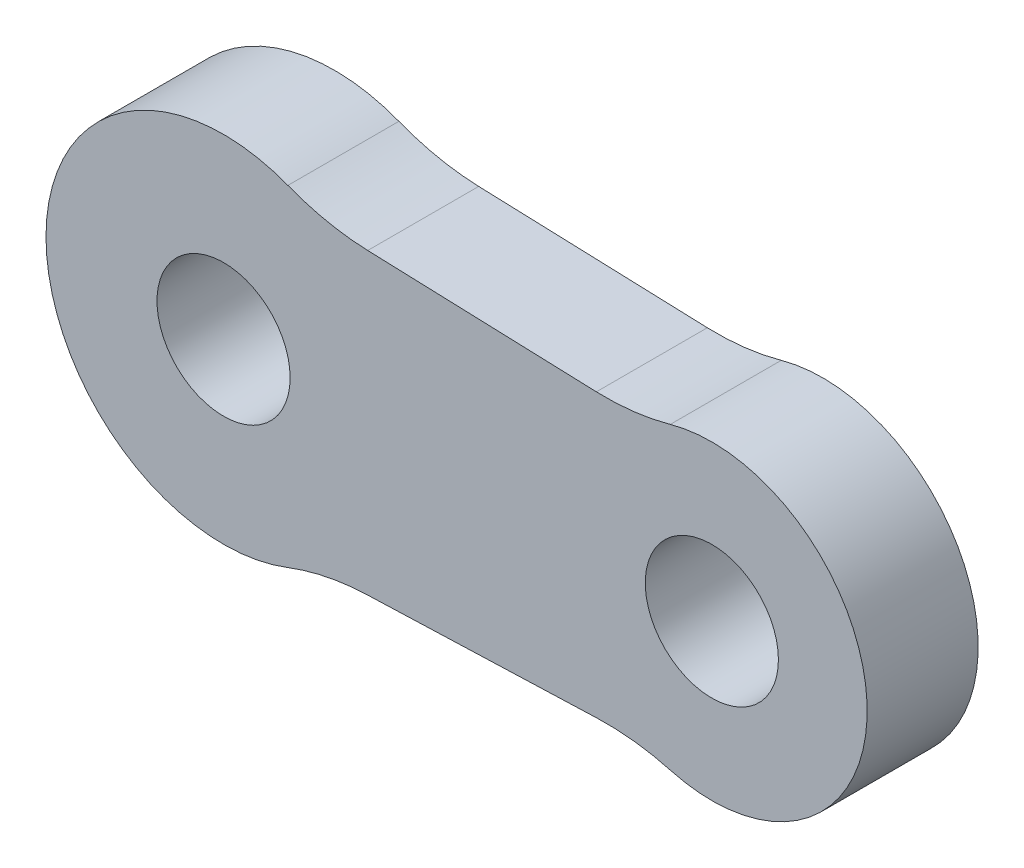
ISO-10303-21;
HEADER;
FILE_DESCRIPTION(('STEP AP214'),'2;1');
FILE_NAME('part.step','',(''),(''),'','','');
FILE_SCHEMA(('AUTOMOTIVE_DESIGN { 1 0 10303 214 1 1 1 1 }'));
ENDSEC;
DATA;
#1=APPLICATION_CONTEXT('core data for automotive mechanical design processes');
#2=APPLICATION_PROTOCOL_DEFINITION('international standard','automotive_design',2000,#1);
#3=PRODUCT_CONTEXT('',#1,'mechanical');
#4=PRODUCT('Part','Part','',(#3));
#5=PRODUCT_RELATED_PRODUCT_CATEGORY('part','',(#4));
#6=PRODUCT_DEFINITION_FORMATION('','',#4);
#7=PRODUCT_DEFINITION_CONTEXT('part definition',#1,'design');
#8=PRODUCT_DEFINITION('design','',#6,#7);
#9=PRODUCT_DEFINITION_SHAPE('','',#8);
#10=(LENGTH_UNIT() NAMED_UNIT(*) SI_UNIT(.MILLI.,.METRE.));
#11=(NAMED_UNIT(*) PLANE_ANGLE_UNIT() SI_UNIT($,.RADIAN.));
#12=(NAMED_UNIT(*) SI_UNIT($,.STERADIAN.) SOLID_ANGLE_UNIT());
#13=UNCERTAINTY_MEASURE_WITH_UNIT(LENGTH_MEASURE(1.E-05),#10,'distance_accuracy_value','');
#14=(GEOMETRIC_REPRESENTATION_CONTEXT(3) GLOBAL_UNCERTAINTY_ASSIGNED_CONTEXT((#13)) GLOBAL_UNIT_ASSIGNED_CONTEXT((#10,
#11,#12)) REPRESENTATION_CONTEXT('',''));
#15=CARTESIAN_POINT('',(0.,0.,0.));
#16=DIRECTION('',(0.,0.,1.));
#17=DIRECTION('',(1.,0.,0.));
#18=AXIS2_PLACEMENT_3D('',#15,#16,#17);
#19=CARTESIAN_POINT('',(34.4240037757681,88.5437065185658,25.));
#20=DIRECTION('',(0.,0.,-1.));
#21=DIRECTION('',(-1.,0.,0.));
#22=AXIS2_PLACEMENT_3D('',#19,#20,#21);
#23=PLANE('',#22);
#24=CARTESIAN_POINT('',(34.4240037757681,88.5437065185658,25.));
#25=DIRECTION('',(0.,0.,-1.));
#26=DIRECTION('',(-1.,0.,0.));
#27=AXIS2_PLACEMENT_3D('',#24,#25,#26);
#28=CIRCLE('',#27,55.);
#29=CARTESIAN_POINT('',(32.4799003556117,33.5780766950867,25.));
#30=VERTEX_POINT('',#29);
#31=CARTESIAN_POINT('',(14.4943173792708,37.2815606393961,25.));
#32=VERTEX_POINT('',#31);
#33=EDGE_CURVE('E229',#30,#32,#28,.T.);
#34=ORIENTED_EDGE('',*,*,#33,.T.);
#35=CARTESIAN_POINT('',(0.,0.,25.));
#36=DIRECTION('',(0.,0.,1.));
#37=DIRECTION('',(1.,0.,0.));
#38=AXIS2_PLACEMENT_3D('',#35,#36,#37);
#39=CIRCLE('',#38,40.);
#40=CARTESIAN_POINT('',(14.3913774062676,-37.3214181985408,25.));
#41=VERTEX_POINT('',#40);
#42=EDGE_CURVE('E155',#32,#41,#39,.T.);
#43=ORIENTED_EDGE('',*,*,#42,.T.);
#44=CARTESIAN_POINT('',(34.1795213398855,-88.6383682215343,25.));
#45=DIRECTION('',(0.,0.,1.));
#46=DIRECTION('',(1.,0.,0.));
#47=AXIS2_PLACEMENT_3D('',#44,#45,#46);
#48=CIRCLE('',#47,55.);
#49=CARTESIAN_POINT('',(32.2284041769591,-33.67298691824,25.));
#50=VERTEX_POINT('',#49);
#51=EDGE_CURVE('E248',#50,#41,#48,.T.);
#52=ORIENTED_EDGE('',*,*,#51,.F.);
#53=DIRECTION('',(0.999370569150805,0.0354748575077526,0.));
#54=VECTOR('',#53,1.);
#55=CARTESIAN_POINT('',(32.2284041769591,-33.67298691824,25.));
#56=LINE('',#55,#54);
#57=CARTESIAN_POINT('',(84.2350153261261,-31.8268978128289,25.));
#58=VERTEX_POINT('',#57);
#59=EDGE_CURVE('E263',#50,#58,#56,.T.);
#60=ORIENTED_EDGE('',*,*,#59,.T.);
#61=CARTESIAN_POINT('',(86.1861324890525,-86.7922791161232,25.));
#62=DIRECTION('',(0.,0.,-1.));
#63=DIRECTION('',(-1.,0.,0.));
#64=AXIS2_PLACEMENT_3D('',#61,#62,#63);
#65=CIRCLE('',#64,55.);
#66=CARTESIAN_POINT('',(100.73905152352,-33.7525529896035,25.));
#67=VERTEX_POINT('',#66);
#68=EDGE_CURVE('E178',#58,#67,#65,.T.);
#69=ORIENTED_EDGE('',*,*,#68,.T.);
#70=CARTESIAN_POINT('',(110.,0.,25.));
#71=DIRECTION('',(0.,0.,1.));
#72=DIRECTION('',(1.,0.,0.));
#73=AXIS2_PLACEMENT_3D('',#70,#71,#72);
#74=CIRCLE('',#73,35.);
#75=CARTESIAN_POINT('',(100.639908058213,33.7251935330443,25.));
#76=VERTEX_POINT('',#75);
#77=EDGE_CURVE('E171',#67,#76,#74,.T.);
#78=ORIENTED_EDGE('',*,*,#77,.T.);
#79=CARTESIAN_POINT('',(85.9311921496908,86.7219262278283,25.));
#80=DIRECTION('',(0.,0.,1.));
#81=DIRECTION('',(1.,0.,0.));
#82=AXIS2_PLACEMENT_3D('',#79,#80,#81);
#83=CIRCLE('',#82,55.);
#84=CARTESIAN_POINT('',(83.9870887295343,31.7562964043492,25.));
#85=VERTEX_POINT('',#84);
#86=EDGE_CURVE('E176',#85,#76,#83,.T.);
#87=ORIENTED_EDGE('',*,*,#86,.F.);
#88=DIRECTION('',(0.99937508769962,-0.0353473349119357,0.));
#89=VECTOR('',#88,1.);
#90=CARTESIAN_POINT('',(32.4799003556117,33.5780766950867,25.));
#91=LINE('',#90,#89);
#92=EDGE_CURVE('E196',#30,#85,#91,.T.);
#93=ORIENTED_EDGE('',*,*,#92,.F.);
#94=EDGE_LOOP('',(#34,#43,#52,#60,#69,#78,#87,#93));
#95=FACE_BOUND('',#94,.T.);
#96=CARTESIAN_POINT('',(0.,0.,25.));
#97=DIRECTION('',(0.,0.,1.));
#98=DIRECTION('',(1.,0.,0.));
#99=AXIS2_PLACEMENT_3D('',#96,#97,#98);
#100=CIRCLE('',#99,15.);
#101=CARTESIAN_POINT('',(15.,0.,25.));
#102=VERTEX_POINT('',#101);
#103=EDGE_CURVE('E206',#102,#102,#100,.T.);
#104=ORIENTED_EDGE('',*,*,#103,.F.);
#105=EDGE_LOOP('',(#104));
#106=FACE_BOUND('',#105,.T.);
#107=CARTESIAN_POINT('',(110.,0.,25.));
#108=DIRECTION('',(0.,0.,1.));
#109=DIRECTION('',(1.,0.,0.));
#110=AXIS2_PLACEMENT_3D('',#107,#108,#109);
#111=CIRCLE('',#110,15.);
#112=CARTESIAN_POINT('',(125.,0.,25.));
#113=VERTEX_POINT('',#112);
#114=EDGE_CURVE('E277',#113,#113,#111,.T.);
#115=ORIENTED_EDGE('',*,*,#114,.F.);
#116=EDGE_LOOP('',(#115));
#117=FACE_BOUND('',#116,.T.);
#118=ADVANCED_FACE('F99',(#95,#106,#117),#23,.F.);
#119=CARTESIAN_POINT('',(34.4240037757681,88.5437065185658,0.));
#120=DIRECTION('',(0.,0.,-1.));
#121=DIRECTION('',(-1.,0.,0.));
#122=AXIS2_PLACEMENT_3D('',#119,#120,#121);
#123=PLANE('',#122);
#124=CARTESIAN_POINT('',(0.,0.,0.));
#125=DIRECTION('',(0.,0.,1.));
#126=DIRECTION('',(1.,0.,0.));
#127=AXIS2_PLACEMENT_3D('',#124,#125,#126);
#128=CIRCLE('',#127,15.);
#129=CARTESIAN_POINT('',(15.,0.,0.));
#130=VERTEX_POINT('',#129);
#131=EDGE_CURVE('E273',#130,#130,#128,.T.);
#132=ORIENTED_EDGE('',*,*,#131,.T.);
#133=EDGE_LOOP('',(#132));
#134=FACE_BOUND('',#133,.T.);
#135=CARTESIAN_POINT('',(34.4240037757681,88.5437065185658,0.));
#136=DIRECTION('',(0.,0.,-1.));
#137=DIRECTION('',(-1.,0.,0.));
#138=AXIS2_PLACEMENT_3D('',#135,#136,#137);
#139=CIRCLE('',#138,55.);
#140=CARTESIAN_POINT('',(32.4799003556117,33.5780766950867,0.));
#141=VERTEX_POINT('',#140);
#142=CARTESIAN_POINT('',(14.4943173792708,37.2815606393961,0.));
#143=VERTEX_POINT('',#142);
#144=EDGE_CURVE('E202',#141,#143,#139,.T.);
#145=ORIENTED_EDGE('',*,*,#144,.F.);
#146=DIRECTION('',(0.99937508769962,-0.0353473349119357,0.));
#147=VECTOR('',#146,1.);
#148=CARTESIAN_POINT('',(32.4799003556117,33.5780766950867,0.));
#149=LINE('',#148,#147);
#150=CARTESIAN_POINT('',(83.9870887295343,31.7562964043492,0.));
#151=VERTEX_POINT('',#150);
#152=EDGE_CURVE('E225',#141,#151,#149,.T.);
#153=ORIENTED_EDGE('',*,*,#152,.T.);
#154=CARTESIAN_POINT('',(85.9311921496908,86.7219262278283,0.));
#155=DIRECTION('',(0.,0.,1.));
#156=DIRECTION('',(1.,0.,0.));
#157=AXIS2_PLACEMENT_3D('',#154,#155,#156);
#158=CIRCLE('',#157,55.);
#159=CARTESIAN_POINT('',(100.639908058213,33.7251935330443,0.));
#160=VERTEX_POINT('',#159);
#161=EDGE_CURVE('E222',#151,#160,#158,.T.);
#162=ORIENTED_EDGE('',*,*,#161,.T.);
#163=CARTESIAN_POINT('',(110.,0.,0.));
#164=DIRECTION('',(0.,0.,1.));
#165=DIRECTION('',(1.,0.,0.));
#166=AXIS2_PLACEMENT_3D('',#163,#164,#165);
#167=CIRCLE('',#166,35.);
#168=CARTESIAN_POINT('',(100.73905152352,-33.7525529896035,0.));
#169=VERTEX_POINT('',#168);
#170=EDGE_CURVE('E188',#169,#160,#167,.T.);
#171=ORIENTED_EDGE('',*,*,#170,.F.);
#172=CARTESIAN_POINT('',(86.1861324890525,-86.7922791161232,0.));
#173=DIRECTION('',(0.,0.,-1.));
#174=DIRECTION('',(-1.,0.,0.));
#175=AXIS2_PLACEMENT_3D('',#172,#173,#174);
#176=CIRCLE('',#175,55.);
#177=CARTESIAN_POINT('',(84.2350153261261,-31.8268978128289,0.));
#178=VERTEX_POINT('',#177);
#179=EDGE_CURVE('E217',#178,#169,#176,.T.);
#180=ORIENTED_EDGE('',*,*,#179,.F.);
#181=DIRECTION('',(0.999370569150805,0.0354748575077526,0.));
#182=VECTOR('',#181,1.);
#183=CARTESIAN_POINT('',(32.2284041769591,-33.67298691824,0.));
#184=LINE('',#183,#182);
#185=CARTESIAN_POINT('',(32.2284041769591,-33.67298691824,0.));
#186=VERTEX_POINT('',#185);
#187=EDGE_CURVE('E214',#186,#178,#184,.T.);
#188=ORIENTED_EDGE('',*,*,#187,.F.);
#189=CARTESIAN_POINT('',(34.1795213398855,-88.6383682215343,0.));
#190=DIRECTION('',(0.,0.,1.));
#191=DIRECTION('',(1.,0.,0.));
#192=AXIS2_PLACEMENT_3D('',#189,#190,#191);
#193=CIRCLE('',#192,55.);
#194=CARTESIAN_POINT('',(14.3913774062676,-37.3214181985408,0.));
#195=VERTEX_POINT('',#194);
#196=EDGE_CURVE('E210',#186,#195,#193,.T.);
#197=ORIENTED_EDGE('',*,*,#196,.T.);
#198=CARTESIAN_POINT('',(0.,0.,0.));
#199=DIRECTION('',(0.,0.,1.));
#200=DIRECTION('',(1.,0.,0.));
#201=AXIS2_PLACEMENT_3D('',#198,#199,#200);
#202=CIRCLE('',#201,40.);
#203=EDGE_CURVE('E205',#143,#195,#202,.T.);
#204=ORIENTED_EDGE('',*,*,#203,.F.);
#205=EDGE_LOOP('',(#145,#153,#162,#171,#180,#188,#197,#204));
#206=FACE_BOUND('',#205,.T.);
#207=CARTESIAN_POINT('',(110.,0.,0.));
#208=DIRECTION('',(0.,0.,1.));
#209=DIRECTION('',(1.,0.,0.));
#210=AXIS2_PLACEMENT_3D('',#207,#208,#209);
#211=CIRCLE('',#210,15.);
#212=CARTESIAN_POINT('',(125.,0.,0.));
#213=VERTEX_POINT('',#212);
#214=EDGE_CURVE('E281',#213,#213,#211,.T.);
#215=ORIENTED_EDGE('',*,*,#214,.T.);
#216=EDGE_LOOP('',(#215));
#217=FACE_BOUND('',#216,.T.);
#218=ADVANCED_FACE('F253',(#134,#206,#217),#123,.T.);
#219=CARTESIAN_POINT('',(34.4240037757681,88.5437065185658,25.));
#220=DIRECTION('',(0.,0.,-1.));
#221=DIRECTION('',(-1.,0.,0.));
#222=AXIS2_PLACEMENT_3D('',#219,#220,#221);
#223=CYLINDRICAL_SURFACE('',#222,55.);
#224=ORIENTED_EDGE('',*,*,#144,.T.);
#225=DIRECTION('',(0.,0.,-1.));
#226=VECTOR('',#225,1.);
#227=CARTESIAN_POINT('',(14.4943173792708,37.2815606393961,25.));
#228=LINE('',#227,#226);
#229=EDGE_CURVE('E12',#32,#143,#228,.T.);
#230=ORIENTED_EDGE('',*,*,#229,.F.);
#231=ORIENTED_EDGE('',*,*,#33,.F.);
#232=DIRECTION('',(0.,0.,-1.));
#233=VECTOR('',#232,1.);
#234=CARTESIAN_POINT('',(32.4799003556117,33.5780766950867,25.));
#235=LINE('',#234,#233);
#236=EDGE_CURVE('E117',#30,#141,#235,.T.);
#237=ORIENTED_EDGE('',*,*,#236,.T.);
#238=EDGE_LOOP('',(#224,#230,#231,#237));
#239=FACE_BOUND('',#238,.T.);
#240=ADVANCED_FACE('F101',(#239),#223,.F.);
#241=CARTESIAN_POINT('',(0.,0.,25.));
#242=DIRECTION('',(0.,0.,-1.));
#243=DIRECTION('',(-1.,0.,0.));
#244=AXIS2_PLACEMENT_3D('',#241,#242,#243);
#245=CYLINDRICAL_SURFACE('',#244,40.);
#246=ORIENTED_EDGE('',*,*,#203,.T.);
#247=DIRECTION('',(0.,0.,-1.));
#248=VECTOR('',#247,1.);
#249=CARTESIAN_POINT('',(14.3913774062676,-37.3214181985408,25.));
#250=LINE('',#249,#248);
#251=EDGE_CURVE('E109',#41,#195,#250,.T.);
#252=ORIENTED_EDGE('',*,*,#251,.F.);
#253=ORIENTED_EDGE('',*,*,#42,.F.);
#254=ORIENTED_EDGE('',*,*,#229,.T.);
#255=EDGE_LOOP('',(#246,#252,#253,#254));
#256=FACE_BOUND('',#255,.T.);
#257=ADVANCED_FACE('F249',(#256),#245,.T.);
#258=CARTESIAN_POINT('',(34.1795213398855,-88.6383682215343,25.));
#259=DIRECTION('',(0.,0.,-1.));
#260=DIRECTION('',(-1.,0.,0.));
#261=AXIS2_PLACEMENT_3D('',#258,#259,#260);
#262=CYLINDRICAL_SURFACE('',#261,55.);
#263=ORIENTED_EDGE('',*,*,#196,.F.);
#264=DIRECTION('',(0.,0.,-1.));
#265=VECTOR('',#264,1.);
#266=CARTESIAN_POINT('',(32.2284041769591,-33.67298691824,25.));
#267=LINE('',#266,#265);
#268=EDGE_CURVE('E240',#50,#186,#267,.T.);
#269=ORIENTED_EDGE('',*,*,#268,.F.);
#270=ORIENTED_EDGE('',*,*,#51,.T.);
#271=ORIENTED_EDGE('',*,*,#251,.T.);
#272=EDGE_LOOP('',(#263,#269,#270,#271));
#273=FACE_BOUND('',#272,.T.);
#274=ADVANCED_FACE('F246',(#273),#262,.F.);
#275=CARTESIAN_POINT('',(32.2284041769591,-33.67298691824,25.));
#276=DIRECTION('',(-0.0354748575077526,0.999370569150805,0.));
#277=DIRECTION('',(-0.999370569150805,-0.0354748575077526,0.));
#278=AXIS2_PLACEMENT_3D('',#275,#276,#277);
#279=PLANE('',#278);
#280=ORIENTED_EDGE('',*,*,#187,.T.);
#281=DIRECTION('',(0.,0.,-1.));
#282=VECTOR('',#281,1.);
#283=CARTESIAN_POINT('',(84.2350153261261,-31.8268978128289,25.));
#284=LINE('',#283,#282);
#285=EDGE_CURVE('E236',#58,#178,#284,.T.);
#286=ORIENTED_EDGE('',*,*,#285,.F.);
#287=ORIENTED_EDGE('',*,*,#59,.F.);
#288=ORIENTED_EDGE('',*,*,#268,.T.);
#289=EDGE_LOOP('',(#280,#286,#287,#288));
#290=FACE_BOUND('',#289,.T.);
#291=ADVANCED_FACE('F258',(#290),#279,.F.);
#292=CARTESIAN_POINT('',(86.1861324890525,-86.7922791161232,25.));
#293=DIRECTION('',(0.,0.,-1.));
#294=DIRECTION('',(-1.,0.,0.));
#295=AXIS2_PLACEMENT_3D('',#292,#293,#294);
#296=CYLINDRICAL_SURFACE('',#295,55.);
#297=ORIENTED_EDGE('',*,*,#179,.T.);
#298=DIRECTION('',(0.,0.,-1.));
#299=VECTOR('',#298,1.);
#300=CARTESIAN_POINT('',(100.73905152352,-33.7525529896035,25.));
#301=LINE('',#300,#299);
#302=EDGE_CURVE('E192',#67,#169,#301,.T.);
#303=ORIENTED_EDGE('',*,*,#302,.F.);
#304=ORIENTED_EDGE('',*,*,#68,.F.);
#305=ORIENTED_EDGE('',*,*,#285,.T.);
#306=EDGE_LOOP('',(#297,#303,#304,#305));
#307=FACE_BOUND('',#306,.T.);
#308=ADVANCED_FACE('F261',(#307),#296,.F.);
#309=CARTESIAN_POINT('',(110.,0.,25.));
#310=DIRECTION('',(0.,0.,-1.));
#311=DIRECTION('',(-1.,0.,0.));
#312=AXIS2_PLACEMENT_3D('',#309,#310,#311);
#313=CYLINDRICAL_SURFACE('',#312,35.);
#314=ORIENTED_EDGE('',*,*,#170,.T.);
#315=DIRECTION('',(0.,0.,-1.));
#316=VECTOR('',#315,1.);
#317=CARTESIAN_POINT('',(100.639908058213,33.7251935330443,25.));
#318=LINE('',#317,#316);
#319=EDGE_CURVE('E185',#76,#160,#318,.T.);
#320=ORIENTED_EDGE('',*,*,#319,.F.);
#321=ORIENTED_EDGE('',*,*,#77,.F.);
#322=ORIENTED_EDGE('',*,*,#302,.T.);
#323=EDGE_LOOP('',(#314,#320,#321,#322));
#324=FACE_BOUND('',#323,.T.);
#325=ADVANCED_FACE('F186',(#324),#313,.T.);
#326=CARTESIAN_POINT('',(85.9311921496908,86.7219262278283,25.));
#327=DIRECTION('',(0.,0.,-1.));
#328=DIRECTION('',(-1.,0.,0.));
#329=AXIS2_PLACEMENT_3D('',#326,#327,#328);
#330=CYLINDRICAL_SURFACE('',#329,55.);
#331=ORIENTED_EDGE('',*,*,#161,.F.);
#332=DIRECTION('',(0.,0.,-1.));
#333=VECTOR('',#332,1.);
#334=CARTESIAN_POINT('',(83.9870887295343,31.7562964043492,25.));
#335=LINE('',#334,#333);
#336=EDGE_CURVE('E143',#85,#151,#335,.T.);
#337=ORIENTED_EDGE('',*,*,#336,.F.);
#338=ORIENTED_EDGE('',*,*,#86,.T.);
#339=ORIENTED_EDGE('',*,*,#319,.T.);
#340=EDGE_LOOP('',(#331,#337,#338,#339));
#341=FACE_BOUND('',#340,.T.);
#342=ADVANCED_FACE('F194',(#341),#330,.F.);
#343=CARTESIAN_POINT('',(32.4799003556117,33.5780766950867,25.));
#344=DIRECTION('',(0.0353473349119357,0.99937508769962,0.));
#345=DIRECTION('',(-0.99937508769962,0.0353473349119357,0.));
#346=AXIS2_PLACEMENT_3D('',#343,#344,#345);
#347=PLANE('',#346);
#348=ORIENTED_EDGE('',*,*,#152,.F.);
#349=ORIENTED_EDGE('',*,*,#236,.F.);
#350=ORIENTED_EDGE('',*,*,#92,.T.);
#351=ORIENTED_EDGE('',*,*,#336,.T.);
#352=EDGE_LOOP('',(#348,#349,#350,#351));
#353=FACE_BOUND('',#352,.T.);
#354=ADVANCED_FACE('F303',(#353),#347,.T.);
#355=CARTESIAN_POINT('',(0.,0.,25.));
#356=DIRECTION('',(0.,0.,-1.));
#357=DIRECTION('',(-1.,0.,0.));
#358=AXIS2_PLACEMENT_3D('',#355,#356,#357);
#359=CYLINDRICAL_SURFACE('',#358,15.);
#360=ORIENTED_EDGE('',*,*,#103,.T.);
#361=EDGE_LOOP('',(#360));
#362=FACE_BOUND('',#361,.T.);
#363=ORIENTED_EDGE('',*,*,#131,.F.);
#364=EDGE_LOOP('',(#363));
#365=FACE_BOUND('',#364,.T.);
#366=ADVANCED_FACE('F300',(#362,#365),#359,.F.);
#367=CARTESIAN_POINT('',(110.,0.,25.));
#368=DIRECTION('',(0.,0.,-1.));
#369=DIRECTION('',(-1.,0.,0.));
#370=AXIS2_PLACEMENT_3D('',#367,#368,#369);
#371=CYLINDRICAL_SURFACE('',#370,15.);
#372=ORIENTED_EDGE('',*,*,#114,.T.);
#373=EDGE_LOOP('',(#372));
#374=FACE_BOUND('',#373,.T.);
#375=ORIENTED_EDGE('',*,*,#214,.F.);
#376=EDGE_LOOP('',(#375));
#377=FACE_BOUND('',#376,.T.);
#378=ADVANCED_FACE('F289',(#374,#377),#371,.F.);
#379=CLOSED_SHELL('',(#118,#218,#240,#257,#274,#291,#308,#325,#342,#354,#366,#378));
#380=MANIFOLD_SOLID_BREP('B2',#379);
#381=ADVANCED_BREP_SHAPE_REPRESENTATION('',(#18,#380),#14);
#382=SHAPE_DEFINITION_REPRESENTATION(#9,#381);
ENDSEC;
END-ISO-10303-21;
